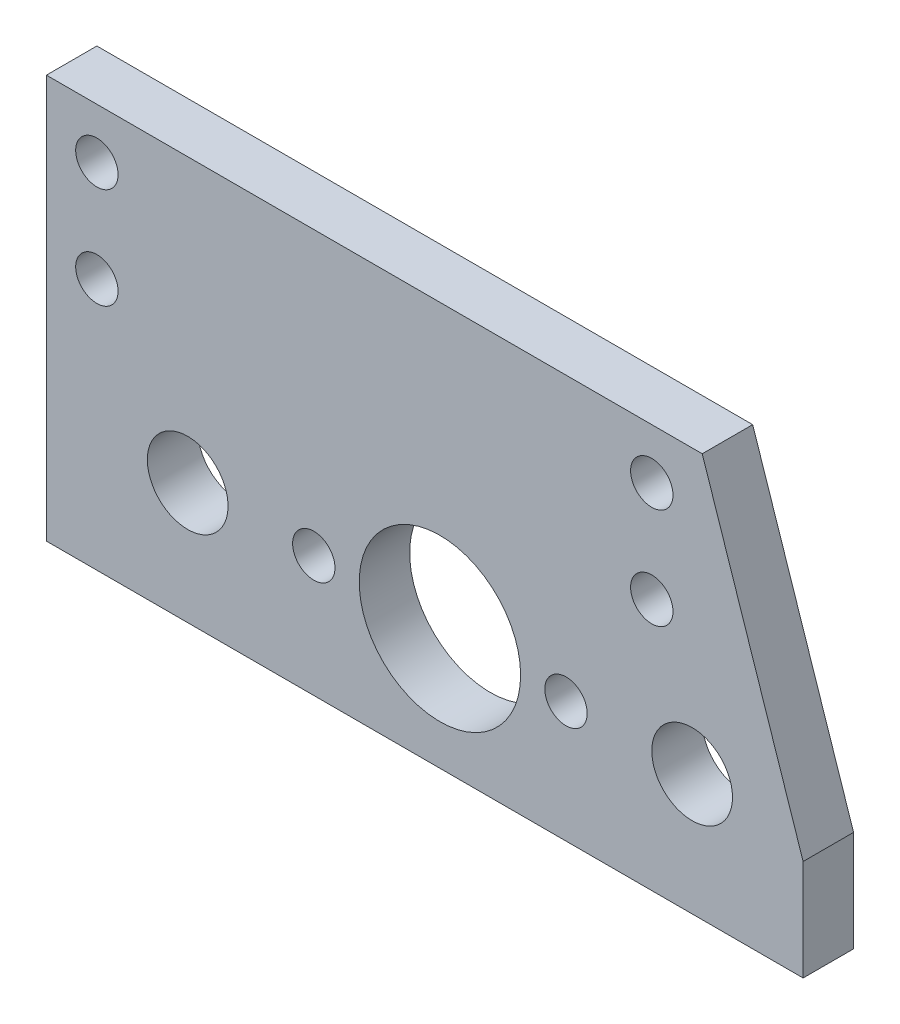
ISO-10303-21;
HEADER;
FILE_DESCRIPTION(('STEP AP214'),'2;1');
FILE_NAME('part.step','',(''),(''),'','','');
FILE_SCHEMA(('AUTOMOTIVE_DESIGN { 1 0 10303 214 1 1 1 1 }'));
ENDSEC;
DATA;
#1=APPLICATION_CONTEXT('core data for automotive mechanical design processes');
#2=APPLICATION_PROTOCOL_DEFINITION('international standard','automotive_design',2000,#1);
#3=PRODUCT_CONTEXT('',#1,'mechanical');
#4=PRODUCT('Part','Part','',(#3));
#5=PRODUCT_RELATED_PRODUCT_CATEGORY('part','',(#4));
#6=PRODUCT_DEFINITION_FORMATION('','',#4);
#7=PRODUCT_DEFINITION_CONTEXT('part definition',#1,'design');
#8=PRODUCT_DEFINITION('design','',#6,#7);
#9=PRODUCT_DEFINITION_SHAPE('','',#8);
#10=(LENGTH_UNIT() NAMED_UNIT(*) SI_UNIT(.MILLI.,.METRE.));
#11=(NAMED_UNIT(*) PLANE_ANGLE_UNIT() SI_UNIT($,.RADIAN.));
#12=(NAMED_UNIT(*) SI_UNIT($,.STERADIAN.) SOLID_ANGLE_UNIT());
#13=UNCERTAINTY_MEASURE_WITH_UNIT(LENGTH_MEASURE(1.E-05),#10,'distance_accuracy_value','');
#14=(GEOMETRIC_REPRESENTATION_CONTEXT(3) GLOBAL_UNCERTAINTY_ASSIGNED_CONTEXT((#13)) GLOBAL_UNIT_ASSIGNED_CONTEXT((#10,
#11,#12)) REPRESENTATION_CONTEXT('',''));
#15=CARTESIAN_POINT('',(0.,0.,0.));
#16=DIRECTION('',(0.,0.,1.));
#17=DIRECTION('',(1.,0.,0.));
#18=AXIS2_PLACEMENT_3D('',#15,#16,#17);
#19=CARTESIAN_POINT('',(0.,0.,5.));
#20=DIRECTION('',(0.,0.,1.));
#21=DIRECTION('',(1.,0.,0.));
#22=AXIS2_PLACEMENT_3D('',#19,#20,#21);
#23=PLANE('',#22);
#24=CARTESIAN_POINT('',(85.6114706783472,-12.6614906832298,5.));
#25=DIRECTION('',(0.,0.,1.));
#26=DIRECTION('',(1.,0.,0.));
#27=AXIS2_PLACEMENT_3D('',#24,#25,#26);
#28=CIRCLE('',#27,2.1);
#29=CARTESIAN_POINT('',(87.7114706783472,-12.6614906832298,5.));
#30=VERTEX_POINT('',#29);
#31=EDGE_CURVE('E297',#30,#30,#28,.T.);
#32=ORIENTED_EDGE('',*,*,#31,.F.);
#33=EDGE_LOOP('',(#32));
#34=FACE_BOUND('',#33,.T.);
#35=CARTESIAN_POINT('',(123.111470678347,-12.6614906832298,5.));
#36=DIRECTION('',(0.,0.,1.));
#37=DIRECTION('',(1.,0.,0.));
#38=AXIS2_PLACEMENT_3D('',#35,#36,#37);
#39=CIRCLE('',#38,3.99999999999999);
#40=CARTESIAN_POINT('',(127.111470678347,-12.6614906832298,5.));
#41=VERTEX_POINT('',#40);
#42=EDGE_CURVE('E309',#41,#41,#39,.T.);
#43=ORIENTED_EDGE('',*,*,#42,.F.);
#44=EDGE_LOOP('',(#43));
#45=FACE_BOUND('',#44,.T.);
#46=CARTESIAN_POINT('',(64.1114706783472,0.338509316770203,5.));
#47=DIRECTION('',(0.,0.,1.));
#48=DIRECTION('',(1.,0.,0.));
#49=AXIS2_PLACEMENT_3D('',#46,#47,#48);
#50=CIRCLE('',#49,2.09999999999999);
#51=CARTESIAN_POINT('',(66.2114706783472,0.338509316770203,5.));
#52=VERTEX_POINT('',#51);
#53=EDGE_CURVE('E321',#52,#52,#50,.T.);
#54=ORIENTED_EDGE('',*,*,#53,.F.);
#55=EDGE_LOOP('',(#54));
#56=FACE_BOUND('',#55,.T.);
#57=CARTESIAN_POINT('',(64.1114706783472,10.3385093167702,5.));
#58=DIRECTION('',(0.,0.,1.));
#59=DIRECTION('',(1.,0.,0.));
#60=AXIS2_PLACEMENT_3D('',#57,#58,#59);
#61=CIRCLE('',#60,2.09999999999999);
#62=CARTESIAN_POINT('',(66.2114706783472,10.3385093167702,5.));
#63=VERTEX_POINT('',#62);
#64=EDGE_CURVE('E333',#63,#63,#61,.T.);
#65=ORIENTED_EDGE('',*,*,#64,.F.);
#66=EDGE_LOOP('',(#65));
#67=FACE_BOUND('',#66,.T.);
#68=DIRECTION('',(0.,-1.,0.));
#69=VECTOR('',#68,1.);
#70=CARTESIAN_POINT('',(59.1114706783472,-6.6614906832298,5.));
#71=LINE('',#70,#69);
#72=CARTESIAN_POINT('',(59.1114706783472,15.3385093167702,5.));
#73=VERTEX_POINT('',#72);
#74=CARTESIAN_POINT('',(59.1114706783472,-24.6614906832298,5.));
#75=VERTEX_POINT('',#74);
#76=EDGE_CURVE('E54',#73,#75,#71,.T.);
#77=ORIENTED_EDGE('',*,*,#76,.T.);
#78=DIRECTION('',(1.,0.,0.));
#79=VECTOR('',#78,1.);
#80=CARTESIAN_POINT('',(59.1114706783472,-24.6614906832298,5.));
#81=LINE('',#80,#79);
#82=CARTESIAN_POINT('',(134.111470678347,-24.6614906832298,5.));
#83=VERTEX_POINT('',#82);
#84=EDGE_CURVE('E89',#75,#83,#81,.T.);
#85=ORIENTED_EDGE('',*,*,#84,.T.);
#86=DIRECTION('',(0.,1.,0.));
#87=VECTOR('',#86,1.);
#88=CARTESIAN_POINT('',(134.111470678347,-14.6614906832298,5.));
#89=LINE('',#88,#87);
#90=CARTESIAN_POINT('',(134.111470678347,-14.6614906832298,5.));
#91=VERTEX_POINT('',#90);
#92=EDGE_CURVE('E94',#83,#91,#89,.T.);
#93=ORIENTED_EDGE('',*,*,#92,.T.);
#94=DIRECTION('',(-0.316227766016838,0.948683298050514,0.));
#95=VECTOR('',#94,1.);
#96=CARTESIAN_POINT('',(124.111470678347,15.3385093167702,5.));
#97=LINE('',#96,#95);
#98=CARTESIAN_POINT('',(124.111470678347,15.3385093167702,5.));
#99=VERTEX_POINT('',#98);
#100=EDGE_CURVE('E98',#91,#99,#97,.T.);
#101=ORIENTED_EDGE('',*,*,#100,.T.);
#102=DIRECTION('',(-1.,0.,0.));
#103=VECTOR('',#102,1.);
#104=CARTESIAN_POINT('',(124.111470678347,15.3385093167702,5.));
#105=LINE('',#104,#103);
#106=EDGE_CURVE('E110',#99,#73,#105,.T.);
#107=ORIENTED_EDGE('',*,*,#106,.T.);
#108=EDGE_LOOP('',(#77,#85,#93,#101,#107));
#109=FACE_BOUND('',#108,.T.);
#110=CARTESIAN_POINT('',(73.1114706783472,-12.6614906832298,5.));
#111=DIRECTION('',(0.,0.,1.));
#112=DIRECTION('',(-1.,0.,0.));
#113=AXIS2_PLACEMENT_3D('',#110,#111,#112);
#114=CIRCLE('',#113,4.00000000000001);
#115=CARTESIAN_POINT('',(69.1114706783472,-12.6614906832298,5.));
#116=VERTEX_POINT('',#115);
#117=EDGE_CURVE('E118',#116,#116,#114,.T.);
#118=ORIENTED_EDGE('',*,*,#117,.F.);
#119=EDGE_LOOP('',(#118));
#120=FACE_BOUND('',#119,.T.);
#121=CARTESIAN_POINT('',(119.111470678347,10.3385093167702,5.));
#122=DIRECTION('',(0.,0.,1.));
#123=DIRECTION('',(1.,0.,0.));
#124=AXIS2_PLACEMENT_3D('',#121,#122,#123);
#125=CIRCLE('',#124,2.09999999999999);
#126=CARTESIAN_POINT('',(121.211470678347,10.3385093167702,5.));
#127=VERTEX_POINT('',#126);
#128=EDGE_CURVE('E327',#127,#127,#125,.T.);
#129=ORIENTED_EDGE('',*,*,#128,.F.);
#130=EDGE_LOOP('',(#129));
#131=FACE_BOUND('',#130,.T.);
#132=CARTESIAN_POINT('',(119.111470678347,0.338509316770208,5.));
#133=DIRECTION('',(0.,0.,1.));
#134=DIRECTION('',(1.,0.,0.));
#135=AXIS2_PLACEMENT_3D('',#132,#133,#134);
#136=CIRCLE('',#135,2.10000000000002);
#137=CARTESIAN_POINT('',(121.211470678347,0.338509316770208,5.));
#138=VERTEX_POINT('',#137);
#139=EDGE_CURVE('E315',#138,#138,#136,.T.);
#140=ORIENTED_EDGE('',*,*,#139,.F.);
#141=EDGE_LOOP('',(#140));
#142=FACE_BOUND('',#141,.T.);
#143=CARTESIAN_POINT('',(98.1114706783472,-12.6614906832298,5.));
#144=DIRECTION('',(0.,0.,1.));
#145=DIRECTION('',(1.,0.,0.));
#146=AXIS2_PLACEMENT_3D('',#143,#144,#145);
#147=CIRCLE('',#146,8.00000000000001);
#148=CARTESIAN_POINT('',(106.111470678347,-12.6614906832298,5.));
#149=VERTEX_POINT('',#148);
#150=EDGE_CURVE('E303',#149,#149,#147,.T.);
#151=ORIENTED_EDGE('',*,*,#150,.F.);
#152=EDGE_LOOP('',(#151));
#153=FACE_BOUND('',#152,.T.);
#154=CARTESIAN_POINT('',(110.611470678347,-12.6614906832298,5.));
#155=DIRECTION('',(0.,0.,1.));
#156=DIRECTION('',(1.,0.,0.));
#157=AXIS2_PLACEMENT_3D('',#154,#155,#156);
#158=CIRCLE('',#157,2.1);
#159=CARTESIAN_POINT('',(112.711470678347,-12.6614906832298,5.));
#160=VERTEX_POINT('',#159);
#161=EDGE_CURVE('E288',#160,#160,#158,.T.);
#162=ORIENTED_EDGE('',*,*,#161,.F.);
#163=EDGE_LOOP('',(#162));
#164=FACE_BOUND('',#163,.T.);
#165=ADVANCED_FACE('F37',(#34,#45,#56,#67,#109,#120,#131,#142,#153,#164),#23,.T.);
#166=CARTESIAN_POINT('',(0.,0.,0.));
#167=DIRECTION('',(0.,0.,1.));
#168=DIRECTION('',(1.,0.,0.));
#169=AXIS2_PLACEMENT_3D('',#166,#167,#168);
#170=PLANE('',#169);
#171=DIRECTION('',(1.,0.,0.));
#172=VECTOR('',#171,1.);
#173=CARTESIAN_POINT('',(134.111470678347,-24.6614906832298,0.));
#174=LINE('',#173,#172);
#175=CARTESIAN_POINT('',(59.1114706783472,-24.6614906832298,0.));
#176=VERTEX_POINT('',#175);
#177=CARTESIAN_POINT('',(134.111470678347,-24.6614906832298,0.));
#178=VERTEX_POINT('',#177);
#179=EDGE_CURVE('E116',#176,#178,#174,.T.);
#180=ORIENTED_EDGE('',*,*,#179,.F.);
#181=DIRECTION('',(0.,-1.,0.));
#182=VECTOR('',#181,1.);
#183=CARTESIAN_POINT('',(59.1114706783472,15.3385093167702,0.));
#184=LINE('',#183,#182);
#185=CARTESIAN_POINT('',(59.1114706783472,15.3385093167702,0.));
#186=VERTEX_POINT('',#185);
#187=EDGE_CURVE('E122',#186,#176,#184,.T.);
#188=ORIENTED_EDGE('',*,*,#187,.F.);
#189=DIRECTION('',(-1.,0.,0.));
#190=VECTOR('',#189,1.);
#191=CARTESIAN_POINT('',(124.111470678347,15.3385093167702,0.));
#192=LINE('',#191,#190);
#193=CARTESIAN_POINT('',(124.111470678347,15.3385093167702,0.));
#194=VERTEX_POINT('',#193);
#195=EDGE_CURVE('E82',#194,#186,#192,.T.);
#196=ORIENTED_EDGE('',*,*,#195,.F.);
#197=DIRECTION('',(-0.316227766016838,0.948683298050514,0.));
#198=VECTOR('',#197,1.);
#199=CARTESIAN_POINT('',(124.111470678347,15.3385093167702,0.));
#200=LINE('',#199,#198);
#201=CARTESIAN_POINT('',(134.111470678347,-14.6614906832298,0.));
#202=VERTEX_POINT('',#201);
#203=EDGE_CURVE('E75',#202,#194,#200,.T.);
#204=ORIENTED_EDGE('',*,*,#203,.F.);
#205=DIRECTION('',(0.,1.,0.));
#206=VECTOR('',#205,1.);
#207=CARTESIAN_POINT('',(134.111470678347,-14.6614906832298,0.));
#208=LINE('',#207,#206);
#209=EDGE_CURVE('E105',#178,#202,#208,.T.);
#210=ORIENTED_EDGE('',*,*,#209,.F.);
#211=EDGE_LOOP('',(#180,#188,#196,#204,#210));
#212=FACE_BOUND('',#211,.T.);
#213=CARTESIAN_POINT('',(73.1114706783472,-12.6614906832298,0.));
#214=DIRECTION('',(0.,0.,1.));
#215=DIRECTION('',(-1.,0.,0.));
#216=AXIS2_PLACEMENT_3D('',#213,#214,#215);
#217=CIRCLE('',#216,4.00000000000001);
#218=CARTESIAN_POINT('',(69.1114706783472,-12.6614906832298,0.));
#219=VERTEX_POINT('',#218);
#220=EDGE_CURVE('E336',#219,#219,#217,.T.);
#221=ORIENTED_EDGE('',*,*,#220,.T.);
#222=EDGE_LOOP('',(#221));
#223=FACE_BOUND('',#222,.T.);
#224=CARTESIAN_POINT('',(64.1114706783472,10.3385093167702,0.));
#225=DIRECTION('',(0.,0.,1.));
#226=DIRECTION('',(1.,0.,0.));
#227=AXIS2_PLACEMENT_3D('',#224,#225,#226);
#228=CIRCLE('',#227,2.09999999999999);
#229=CARTESIAN_POINT('',(66.2114706783472,10.3385093167702,0.));
#230=VERTEX_POINT('',#229);
#231=EDGE_CURVE('E330',#230,#230,#228,.T.);
#232=ORIENTED_EDGE('',*,*,#231,.T.);
#233=EDGE_LOOP('',(#232));
#234=FACE_BOUND('',#233,.T.);
#235=CARTESIAN_POINT('',(119.111470678347,10.3385093167702,0.));
#236=DIRECTION('',(0.,0.,1.));
#237=DIRECTION('',(1.,0.,0.));
#238=AXIS2_PLACEMENT_3D('',#235,#236,#237);
#239=CIRCLE('',#238,2.09999999999999);
#240=CARTESIAN_POINT('',(121.211470678347,10.3385093167702,0.));
#241=VERTEX_POINT('',#240);
#242=EDGE_CURVE('E324',#241,#241,#239,.T.);
#243=ORIENTED_EDGE('',*,*,#242,.T.);
#244=EDGE_LOOP('',(#243));
#245=FACE_BOUND('',#244,.T.);
#246=CARTESIAN_POINT('',(64.1114706783472,0.338509316770203,0.));
#247=DIRECTION('',(0.,0.,1.));
#248=DIRECTION('',(1.,0.,0.));
#249=AXIS2_PLACEMENT_3D('',#246,#247,#248);
#250=CIRCLE('',#249,2.09999999999999);
#251=CARTESIAN_POINT('',(66.2114706783472,0.338509316770203,0.));
#252=VERTEX_POINT('',#251);
#253=EDGE_CURVE('E318',#252,#252,#250,.T.);
#254=ORIENTED_EDGE('',*,*,#253,.T.);
#255=EDGE_LOOP('',(#254));
#256=FACE_BOUND('',#255,.T.);
#257=CARTESIAN_POINT('',(119.111470678347,0.338509316770208,0.));
#258=DIRECTION('',(0.,0.,1.));
#259=DIRECTION('',(1.,0.,0.));
#260=AXIS2_PLACEMENT_3D('',#257,#258,#259);
#261=CIRCLE('',#260,2.10000000000002);
#262=CARTESIAN_POINT('',(121.211470678347,0.338509316770208,0.));
#263=VERTEX_POINT('',#262);
#264=EDGE_CURVE('E312',#263,#263,#261,.T.);
#265=ORIENTED_EDGE('',*,*,#264,.T.);
#266=EDGE_LOOP('',(#265));
#267=FACE_BOUND('',#266,.T.);
#268=CARTESIAN_POINT('',(123.111470678347,-12.6614906832298,0.));
#269=DIRECTION('',(0.,0.,1.));
#270=DIRECTION('',(1.,0.,0.));
#271=AXIS2_PLACEMENT_3D('',#268,#269,#270);
#272=CIRCLE('',#271,3.99999999999999);
#273=CARTESIAN_POINT('',(127.111470678347,-12.6614906832298,0.));
#274=VERTEX_POINT('',#273);
#275=EDGE_CURVE('E306',#274,#274,#272,.T.);
#276=ORIENTED_EDGE('',*,*,#275,.T.);
#277=EDGE_LOOP('',(#276));
#278=FACE_BOUND('',#277,.T.);
#279=CARTESIAN_POINT('',(98.1114706783472,-12.6614906832298,0.));
#280=DIRECTION('',(0.,0.,1.));
#281=DIRECTION('',(1.,0.,0.));
#282=AXIS2_PLACEMENT_3D('',#279,#280,#281);
#283=CIRCLE('',#282,8.00000000000001);
#284=CARTESIAN_POINT('',(106.111470678347,-12.6614906832298,0.));
#285=VERTEX_POINT('',#284);
#286=EDGE_CURVE('E300',#285,#285,#283,.T.);
#287=ORIENTED_EDGE('',*,*,#286,.T.);
#288=EDGE_LOOP('',(#287));
#289=FACE_BOUND('',#288,.T.);
#290=CARTESIAN_POINT('',(85.6114706783472,-12.6614906832298,0.));
#291=DIRECTION('',(0.,0.,1.));
#292=DIRECTION('',(1.,0.,0.));
#293=AXIS2_PLACEMENT_3D('',#290,#291,#292);
#294=CIRCLE('',#293,2.1);
#295=CARTESIAN_POINT('',(87.7114706783472,-12.6614906832298,0.));
#296=VERTEX_POINT('',#295);
#297=EDGE_CURVE('E294',#296,#296,#294,.T.);
#298=ORIENTED_EDGE('',*,*,#297,.T.);
#299=EDGE_LOOP('',(#298));
#300=FACE_BOUND('',#299,.T.);
#301=CARTESIAN_POINT('',(110.611470678347,-12.6614906832298,0.));
#302=DIRECTION('',(0.,0.,1.));
#303=DIRECTION('',(1.,0.,0.));
#304=AXIS2_PLACEMENT_3D('',#301,#302,#303);
#305=CIRCLE('',#304,2.1);
#306=CARTESIAN_POINT('',(112.711470678347,-12.6614906832298,0.));
#307=VERTEX_POINT('',#306);
#308=EDGE_CURVE('E291',#307,#307,#305,.T.);
#309=ORIENTED_EDGE('',*,*,#308,.T.);
#310=EDGE_LOOP('',(#309));
#311=FACE_BOUND('',#310,.T.);
#312=ADVANCED_FACE('F127',(#212,#223,#234,#245,#256,#267,#278,#289,#300,#311),#170,.F.);
#313=CARTESIAN_POINT('',(134.111470678347,-24.6614906832298,5.));
#314=DIRECTION('',(0.,1.,0.));
#315=DIRECTION('',(-1.,0.,0.));
#316=AXIS2_PLACEMENT_3D('',#313,#314,#315);
#317=PLANE('',#316);
#318=ORIENTED_EDGE('',*,*,#179,.T.);
#319=DIRECTION('',(0.,0.,-1.));
#320=VECTOR('',#319,1.);
#321=CARTESIAN_POINT('',(134.111470678347,-24.6614906832298,5.));
#322=LINE('',#321,#320);
#323=EDGE_CURVE('E46',#83,#178,#322,.T.);
#324=ORIENTED_EDGE('',*,*,#323,.F.);
#325=ORIENTED_EDGE('',*,*,#84,.F.);
#326=DIRECTION('',(0.,0.,-1.));
#327=VECTOR('',#326,1.);
#328=CARTESIAN_POINT('',(59.1114706783472,-24.6614906832298,5.));
#329=LINE('',#328,#327);
#330=EDGE_CURVE('E11',#75,#176,#329,.T.);
#331=ORIENTED_EDGE('',*,*,#330,.T.);
#332=EDGE_LOOP('',(#318,#324,#325,#331));
#333=FACE_BOUND('',#332,.T.);
#334=ADVANCED_FACE('F39',(#333),#317,.F.);
#335=CARTESIAN_POINT('',(134.111470678347,-14.6614906832298,5.));
#336=DIRECTION('',(-1.,0.,0.));
#337=DIRECTION('',(0.,0.,1.));
#338=AXIS2_PLACEMENT_3D('',#335,#336,#337);
#339=PLANE('',#338);
#340=ORIENTED_EDGE('',*,*,#209,.T.);
#341=DIRECTION('',(0.,0.,-1.));
#342=VECTOR('',#341,1.);
#343=CARTESIAN_POINT('',(134.111470678347,-14.6614906832298,5.));
#344=LINE('',#343,#342);
#345=EDGE_CURVE('E102',#91,#202,#344,.T.);
#346=ORIENTED_EDGE('',*,*,#345,.F.);
#347=ORIENTED_EDGE('',*,*,#92,.F.);
#348=ORIENTED_EDGE('',*,*,#323,.T.);
#349=EDGE_LOOP('',(#340,#346,#347,#348));
#350=FACE_BOUND('',#349,.T.);
#351=ADVANCED_FACE('F103',(#350),#339,.F.);
#352=CARTESIAN_POINT('',(124.111470678347,15.3385093167702,5.));
#353=DIRECTION('',(-0.948683298050514,-0.316227766016838,0.));
#354=DIRECTION('',(0.316227766016838,-0.948683298050514,0.));
#355=AXIS2_PLACEMENT_3D('',#352,#353,#354);
#356=PLANE('',#355);
#357=ORIENTED_EDGE('',*,*,#203,.T.);
#358=DIRECTION('',(0.,0.,-1.));
#359=VECTOR('',#358,1.);
#360=CARTESIAN_POINT('',(124.111470678347,15.3385093167702,5.));
#361=LINE('',#360,#359);
#362=EDGE_CURVE('E106',#99,#194,#361,.T.);
#363=ORIENTED_EDGE('',*,*,#362,.F.);
#364=ORIENTED_EDGE('',*,*,#100,.F.);
#365=ORIENTED_EDGE('',*,*,#345,.T.);
#366=EDGE_LOOP('',(#357,#363,#364,#365));
#367=FACE_BOUND('',#366,.T.);
#368=ADVANCED_FACE('F108',(#367),#356,.F.);
#369=CARTESIAN_POINT('',(124.111470678347,15.3385093167702,5.));
#370=DIRECTION('',(0.,-1.,0.));
#371=DIRECTION('',(1.,0.,0.));
#372=AXIS2_PLACEMENT_3D('',#369,#370,#371);
#373=PLANE('',#372);
#374=ORIENTED_EDGE('',*,*,#195,.T.);
#375=DIRECTION('',(0.,0.,-1.));
#376=VECTOR('',#375,1.);
#377=CARTESIAN_POINT('',(59.1114706783472,15.3385093167702,5.));
#378=LINE('',#377,#376);
#379=EDGE_CURVE('E112',#73,#186,#378,.T.);
#380=ORIENTED_EDGE('',*,*,#379,.F.);
#381=ORIENTED_EDGE('',*,*,#106,.F.);
#382=ORIENTED_EDGE('',*,*,#362,.T.);
#383=EDGE_LOOP('',(#374,#380,#381,#382));
#384=FACE_BOUND('',#383,.T.);
#385=ADVANCED_FACE('F150',(#384),#373,.F.);
#386=CARTESIAN_POINT('',(59.1114706783472,15.3385093167702,5.));
#387=DIRECTION('',(1.,0.,0.));
#388=DIRECTION('',(0.,0.,-1.));
#389=AXIS2_PLACEMENT_3D('',#386,#387,#388);
#390=PLANE('',#389);
#391=ORIENTED_EDGE('',*,*,#187,.T.);
#392=ORIENTED_EDGE('',*,*,#330,.F.);
#393=ORIENTED_EDGE('',*,*,#76,.F.);
#394=ORIENTED_EDGE('',*,*,#379,.T.);
#395=EDGE_LOOP('',(#391,#392,#393,#394));
#396=FACE_BOUND('',#395,.T.);
#397=ADVANCED_FACE('F130',(#396),#390,.F.);
#398=CARTESIAN_POINT('',(73.1114706783472,-12.6614906832298,5.));
#399=DIRECTION('',(0.,0.,-1.));
#400=DIRECTION('',(-1.,0.,0.));
#401=AXIS2_PLACEMENT_3D('',#398,#399,#400);
#402=CYLINDRICAL_SURFACE('',#401,4.00000000000001);
#403=ORIENTED_EDGE('',*,*,#117,.T.);
#404=EDGE_LOOP('',(#403));
#405=FACE_BOUND('',#404,.T.);
#406=ORIENTED_EDGE('',*,*,#220,.F.);
#407=EDGE_LOOP('',(#406));
#408=FACE_BOUND('',#407,.T.);
#409=ADVANCED_FACE('F145',(#405,#408),#402,.F.);
#410=CARTESIAN_POINT('',(64.1114706783472,10.3385093167702,5.));
#411=DIRECTION('',(0.,0.,-1.));
#412=DIRECTION('',(-1.,0.,0.));
#413=AXIS2_PLACEMENT_3D('',#410,#411,#412);
#414=CYLINDRICAL_SURFACE('',#413,2.09999999999999);
#415=ORIENTED_EDGE('',*,*,#64,.T.);
#416=EDGE_LOOP('',(#415));
#417=FACE_BOUND('',#416,.T.);
#418=ORIENTED_EDGE('',*,*,#231,.F.);
#419=EDGE_LOOP('',(#418));
#420=FACE_BOUND('',#419,.T.);
#421=ADVANCED_FACE('F172',(#417,#420),#414,.F.);
#422=CARTESIAN_POINT('',(119.111470678347,10.3385093167702,5.));
#423=DIRECTION('',(0.,0.,-1.));
#424=DIRECTION('',(-1.,0.,0.));
#425=AXIS2_PLACEMENT_3D('',#422,#423,#424);
#426=CYLINDRICAL_SURFACE('',#425,2.09999999999999);
#427=ORIENTED_EDGE('',*,*,#128,.T.);
#428=EDGE_LOOP('',(#427));
#429=FACE_BOUND('',#428,.T.);
#430=ORIENTED_EDGE('',*,*,#242,.F.);
#431=EDGE_LOOP('',(#430));
#432=FACE_BOUND('',#431,.T.);
#433=ADVANCED_FACE('F179',(#429,#432),#426,.F.);
#434=CARTESIAN_POINT('',(64.1114706783472,0.338509316770203,5.));
#435=DIRECTION('',(0.,0.,-1.));
#436=DIRECTION('',(-1.,0.,0.));
#437=AXIS2_PLACEMENT_3D('',#434,#435,#436);
#438=CYLINDRICAL_SURFACE('',#437,2.09999999999999);
#439=ORIENTED_EDGE('',*,*,#53,.T.);
#440=EDGE_LOOP('',(#439));
#441=FACE_BOUND('',#440,.T.);
#442=ORIENTED_EDGE('',*,*,#253,.F.);
#443=EDGE_LOOP('',(#442));
#444=FACE_BOUND('',#443,.T.);
#445=ADVANCED_FACE('F186',(#441,#444),#438,.F.);
#446=CARTESIAN_POINT('',(119.111470678347,0.338509316770208,5.));
#447=DIRECTION('',(0.,0.,-1.));
#448=DIRECTION('',(-1.,0.,0.));
#449=AXIS2_PLACEMENT_3D('',#446,#447,#448);
#450=CYLINDRICAL_SURFACE('',#449,2.10000000000002);
#451=ORIENTED_EDGE('',*,*,#139,.T.);
#452=EDGE_LOOP('',(#451));
#453=FACE_BOUND('',#452,.T.);
#454=ORIENTED_EDGE('',*,*,#264,.F.);
#455=EDGE_LOOP('',(#454));
#456=FACE_BOUND('',#455,.T.);
#457=ADVANCED_FACE('F194',(#453,#456),#450,.F.);
#458=CARTESIAN_POINT('',(123.111470678347,-12.6614906832298,5.));
#459=DIRECTION('',(0.,0.,-1.));
#460=DIRECTION('',(-1.,0.,0.));
#461=AXIS2_PLACEMENT_3D('',#458,#459,#460);
#462=CYLINDRICAL_SURFACE('',#461,3.99999999999999);
#463=ORIENTED_EDGE('',*,*,#42,.T.);
#464=EDGE_LOOP('',(#463));
#465=FACE_BOUND('',#464,.T.);
#466=ORIENTED_EDGE('',*,*,#275,.F.);
#467=EDGE_LOOP('',(#466));
#468=FACE_BOUND('',#467,.T.);
#469=ADVANCED_FACE('F202',(#465,#468),#462,.F.);
#470=CARTESIAN_POINT('',(98.1114706783472,-12.6614906832298,5.));
#471=DIRECTION('',(0.,0.,-1.));
#472=DIRECTION('',(-1.,0.,0.));
#473=AXIS2_PLACEMENT_3D('',#470,#471,#472);
#474=CYLINDRICAL_SURFACE('',#473,8.00000000000001);
#475=ORIENTED_EDGE('',*,*,#150,.T.);
#476=EDGE_LOOP('',(#475));
#477=FACE_BOUND('',#476,.T.);
#478=ORIENTED_EDGE('',*,*,#286,.F.);
#479=EDGE_LOOP('',(#478));
#480=FACE_BOUND('',#479,.T.);
#481=ADVANCED_FACE('F210',(#477,#480),#474,.F.);
#482=CARTESIAN_POINT('',(85.6114706783472,-12.6614906832298,5.));
#483=DIRECTION('',(0.,0.,-1.));
#484=DIRECTION('',(-1.,0.,0.));
#485=AXIS2_PLACEMENT_3D('',#482,#483,#484);
#486=CYLINDRICAL_SURFACE('',#485,2.1);
#487=ORIENTED_EDGE('',*,*,#31,.T.);
#488=EDGE_LOOP('',(#487));
#489=FACE_BOUND('',#488,.T.);
#490=ORIENTED_EDGE('',*,*,#297,.F.);
#491=EDGE_LOOP('',(#490));
#492=FACE_BOUND('',#491,.T.);
#493=ADVANCED_FACE('F218',(#489,#492),#486,.F.);
#494=CARTESIAN_POINT('',(110.611470678347,-12.6614906832298,5.));
#495=DIRECTION('',(0.,0.,-1.));
#496=DIRECTION('',(-1.,0.,0.));
#497=AXIS2_PLACEMENT_3D('',#494,#495,#496);
#498=CYLINDRICAL_SURFACE('',#497,2.1);
#499=ORIENTED_EDGE('',*,*,#161,.T.);
#500=EDGE_LOOP('',(#499));
#501=FACE_BOUND('',#500,.T.);
#502=ORIENTED_EDGE('',*,*,#308,.F.);
#503=EDGE_LOOP('',(#502));
#504=FACE_BOUND('',#503,.T.);
#505=ADVANCED_FACE('F226',(#501,#504),#498,.F.);
#506=CLOSED_SHELL('',(#165,#312,#334,#351,#368,#385,#397,#409,#421,#433,#445,#457,#469,#481,
#493,#505));
#507=MANIFOLD_SOLID_BREP('B2',#506);
#508=ADVANCED_BREP_SHAPE_REPRESENTATION('',(#18,#507),#14);
#509=SHAPE_DEFINITION_REPRESENTATION(#9,#508);
ENDSEC;
END-ISO-10303-21;
